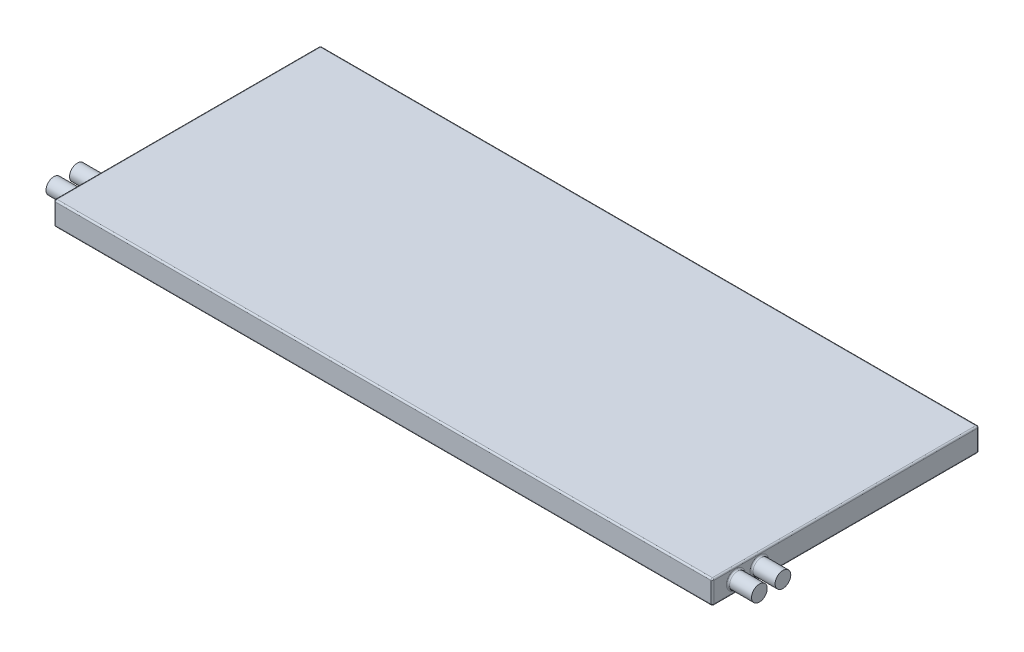
ISO-10303-21;
HEADER;
FILE_DESCRIPTION(('STEP AP214'),'2;1');
FILE_NAME('part.step','',(''),(''),'','','');
FILE_SCHEMA(('AUTOMOTIVE_DESIGN { 1 0 10303 214 1 1 1 1 }'));
ENDSEC;
DATA;
#1=APPLICATION_CONTEXT('core data for automotive mechanical design processes');
#2=APPLICATION_PROTOCOL_DEFINITION('international standard','automotive_design',2000,#1);
#3=PRODUCT_CONTEXT('',#1,'mechanical');
#4=PRODUCT('Part','Part','',(#3));
#5=PRODUCT_RELATED_PRODUCT_CATEGORY('part','',(#4));
#6=PRODUCT_DEFINITION_FORMATION('','',#4);
#7=PRODUCT_DEFINITION_CONTEXT('part definition',#1,'design');
#8=PRODUCT_DEFINITION('design','',#6,#7);
#9=PRODUCT_DEFINITION_SHAPE('','',#8);
#10=(LENGTH_UNIT() NAMED_UNIT(*) SI_UNIT(.MILLI.,.METRE.));
#11=(NAMED_UNIT(*) PLANE_ANGLE_UNIT() SI_UNIT($,.RADIAN.));
#12=(NAMED_UNIT(*) SI_UNIT($,.STERADIAN.) SOLID_ANGLE_UNIT());
#13=UNCERTAINTY_MEASURE_WITH_UNIT(LENGTH_MEASURE(1.E-05),#10,'distance_accuracy_value','');
#14=(GEOMETRIC_REPRESENTATION_CONTEXT(3) GLOBAL_UNCERTAINTY_ASSIGNED_CONTEXT((#13)) GLOBAL_UNIT_ASSIGNED_CONTEXT((#10,
#11,#12)) REPRESENTATION_CONTEXT('',''));
#15=CARTESIAN_POINT('',(0.,0.,0.));
#16=DIRECTION('',(0.,0.,1.));
#17=DIRECTION('',(1.,0.,0.));
#18=AXIS2_PLACEMENT_3D('',#15,#16,#17);
#19=CARTESIAN_POINT('',(-21.,1.5,8.50000000000001));
#20=DIRECTION('',(1.,0.,0.));
#21=DIRECTION('',(0.,0.,-1.));
#22=AXIS2_PLACEMENT_3D('',#19,#20,#21);
#23=PLANE('',#22);
#24=CARTESIAN_POINT('',(-21.,0.75,7.00000000000001));
#25=DIRECTION('',(1.,0.,0.));
#26=DIRECTION('',(0.,0.,-1.));
#27=AXIS2_PLACEMENT_3D('',#24,#25,#26);
#28=CIRCLE('',#27,0.600000000000001);
#29=CARTESIAN_POINT('',(-21.,0.75,6.40000000000001));
#30=VERTEX_POINT('',#29);
#31=EDGE_CURVE('E246',#30,#30,#28,.T.);
#32=ORIENTED_EDGE('',*,*,#31,.T.);
#33=EDGE_LOOP('',(#32));
#34=FACE_BOUND('',#33,.T.);
#35=CARTESIAN_POINT('',(-21.,0.749999999999999,5.50000000000001));
#36=DIRECTION('',(1.,0.,0.));
#37=DIRECTION('',(0.,0.,-1.));
#38=AXIS2_PLACEMENT_3D('',#35,#36,#37);
#39=CIRCLE('',#38,0.600000000000001);
#40=CARTESIAN_POINT('',(-21.,0.749999999999999,4.90000000000001));
#41=VERTEX_POINT('',#40);
#42=EDGE_CURVE('E243',#41,#41,#39,.T.);
#43=ORIENTED_EDGE('',*,*,#42,.T.);
#44=EDGE_LOOP('',(#43));
#45=FACE_BOUND('',#44,.T.);
#46=DIRECTION('',(0.,0.,1.));
#47=VECTOR('',#46,1.);
#48=CARTESIAN_POINT('',(-21.,1.4,-8.5));
#49=LINE('',#48,#47);
#50=CARTESIAN_POINT('',(-21.,1.4,8.40000000000001));
#51=VERTEX_POINT('',#50);
#52=CARTESIAN_POINT('',(-21.,1.4,-8.4));
#53=VERTEX_POINT('',#52);
#54=EDGE_CURVE('E236',#51,#53,#49,.F.);
#55=ORIENTED_EDGE('',*,*,#54,.T.);
#56=DIRECTION('',(0.,-1.,0.));
#57=VECTOR('',#56,1.);
#58=CARTESIAN_POINT('',(-21.,1.5,-8.4));
#59=LINE('',#58,#57);
#60=CARTESIAN_POINT('',(-21.,0.1,-8.4));
#61=VERTEX_POINT('',#60);
#62=EDGE_CURVE('E161',#53,#61,#59,.T.);
#63=ORIENTED_EDGE('',*,*,#62,.T.);
#64=DIRECTION('',(0.,0.,1.));
#65=VECTOR('',#64,1.);
#66=CARTESIAN_POINT('',(-21.,0.1,8.50000000000001));
#67=LINE('',#66,#65);
#68=CARTESIAN_POINT('',(-21.,0.1,8.40000000000001));
#69=VERTEX_POINT('',#68);
#70=EDGE_CURVE('E240',#61,#69,#67,.T.);
#71=ORIENTED_EDGE('',*,*,#70,.T.);
#72=DIRECTION('',(0.,-1.,0.));
#73=VECTOR('',#72,1.);
#74=CARTESIAN_POINT('',(-21.,1.5,8.40000000000001));
#75=LINE('',#74,#73);
#76=EDGE_CURVE('E238',#69,#51,#75,.F.);
#77=ORIENTED_EDGE('',*,*,#76,.T.);
#78=EDGE_LOOP('',(#55,#63,#71,#77));
#79=FACE_BOUND('',#78,.T.);
#80=ADVANCED_FACE('F39',(#34,#45,#79),#23,.F.);
#81=CARTESIAN_POINT('',(21.,1.5,8.5));
#82=DIRECTION('',(0.,0.,-1.));
#83=DIRECTION('',(-1.,0.,0.));
#84=AXIS2_PLACEMENT_3D('',#81,#82,#83);
#85=PLANE('',#84);
#86=DIRECTION('',(0.,-1.,0.));
#87=VECTOR('',#86,1.);
#88=CARTESIAN_POINT('',(-20.9,1.5,8.50000000000001));
#89=LINE('',#88,#87);
#90=CARTESIAN_POINT('',(-20.9,1.4,8.50000000000001));
#91=VERTEX_POINT('',#90);
#92=CARTESIAN_POINT('',(-20.9,0.1,8.50000000000001));
#93=VERTEX_POINT('',#92);
#94=EDGE_CURVE('E280',#91,#93,#89,.T.);
#95=ORIENTED_EDGE('',*,*,#94,.T.);
#96=DIRECTION('',(1.,0.,0.));
#97=VECTOR('',#96,1.);
#98=CARTESIAN_POINT('',(21.,0.1,8.5));
#99=LINE('',#98,#97);
#100=CARTESIAN_POINT('',(20.9,0.1,8.5));
#101=VERTEX_POINT('',#100);
#102=EDGE_CURVE('E283',#93,#101,#99,.T.);
#103=ORIENTED_EDGE('',*,*,#102,.T.);
#104=DIRECTION('',(0.,-1.,0.));
#105=VECTOR('',#104,1.);
#106=CARTESIAN_POINT('',(20.9,1.5,8.5));
#107=LINE('',#106,#105);
#108=CARTESIAN_POINT('',(20.9,1.4,8.5));
#109=VERTEX_POINT('',#108);
#110=EDGE_CURVE('E278',#101,#109,#107,.F.);
#111=ORIENTED_EDGE('',*,*,#110,.T.);
#112=DIRECTION('',(1.,0.,0.));
#113=VECTOR('',#112,1.);
#114=CARTESIAN_POINT('',(-21.,1.4,8.50000000000001));
#115=LINE('',#114,#113);
#116=EDGE_CURVE('E276',#109,#91,#115,.F.);
#117=ORIENTED_EDGE('',*,*,#116,.T.);
#118=EDGE_LOOP('',(#95,#103,#111,#117));
#119=FACE_BOUND('',#118,.T.);
#120=ADVANCED_FACE('F374',(#119),#85,.F.);
#121=CARTESIAN_POINT('',(21.,1.5,8.5));
#122=DIRECTION('',(-1.,0.,0.));
#123=DIRECTION('',(0.,0.,1.));
#124=AXIS2_PLACEMENT_3D('',#121,#122,#123);
#125=PLANE('',#124);
#126=CARTESIAN_POINT('',(21.,0.75,7.00000000000001));
#127=DIRECTION('',(-1.,0.,0.));
#128=DIRECTION('',(0.,0.,1.));
#129=AXIS2_PLACEMENT_3D('',#126,#127,#128);
#130=CIRCLE('',#129,0.600000000000001);
#131=CARTESIAN_POINT('',(21.,0.75,7.60000000000001));
#132=VERTEX_POINT('',#131);
#133=EDGE_CURVE('E267',#132,#132,#130,.T.);
#134=ORIENTED_EDGE('',*,*,#133,.T.);
#135=EDGE_LOOP('',(#134));
#136=FACE_BOUND('',#135,.T.);
#137=CARTESIAN_POINT('',(21.,0.749999999999999,5.50000000000001));
#138=DIRECTION('',(-1.,0.,0.));
#139=DIRECTION('',(0.,0.,1.));
#140=AXIS2_PLACEMENT_3D('',#137,#138,#139);
#141=CIRCLE('',#140,0.600000000000001);
#142=CARTESIAN_POINT('',(21.,0.749999999999999,6.10000000000001));
#143=VERTEX_POINT('',#142);
#144=EDGE_CURVE('E264',#143,#143,#141,.T.);
#145=ORIENTED_EDGE('',*,*,#144,.T.);
#146=EDGE_LOOP('',(#145));
#147=FACE_BOUND('',#146,.T.);
#148=DIRECTION('',(0.,0.,-1.));
#149=VECTOR('',#148,1.);
#150=CARTESIAN_POINT('',(21.,0.1,8.5));
#151=LINE('',#150,#149);
#152=CARTESIAN_POINT('',(21.,0.1,8.4));
#153=VERTEX_POINT('',#152);
#154=CARTESIAN_POINT('',(21.,0.1,-8.4));
#155=VERTEX_POINT('',#154);
#156=EDGE_CURVE('E259',#153,#155,#151,.T.);
#157=ORIENTED_EDGE('',*,*,#156,.T.);
#158=DIRECTION('',(0.,-1.,0.));
#159=VECTOR('',#158,1.);
#160=CARTESIAN_POINT('',(21.,1.5,-8.4));
#161=LINE('',#160,#159);
#162=CARTESIAN_POINT('',(21.,1.4,-8.4));
#163=VERTEX_POINT('',#162);
#164=EDGE_CURVE('E261',#155,#163,#161,.F.);
#165=ORIENTED_EDGE('',*,*,#164,.T.);
#166=DIRECTION('',(0.,0.,-1.));
#167=VECTOR('',#166,1.);
#168=CARTESIAN_POINT('',(21.,1.4,8.5));
#169=LINE('',#168,#167);
#170=CARTESIAN_POINT('',(21.,1.4,8.4));
#171=VERTEX_POINT('',#170);
#172=EDGE_CURVE('E255',#163,#171,#169,.F.);
#173=ORIENTED_EDGE('',*,*,#172,.T.);
#174=DIRECTION('',(0.,-1.,0.));
#175=VECTOR('',#174,1.);
#176=CARTESIAN_POINT('',(21.,1.5,8.4));
#177=LINE('',#176,#175);
#178=EDGE_CURVE('E257',#171,#153,#177,.T.);
#179=ORIENTED_EDGE('',*,*,#178,.T.);
#180=EDGE_LOOP('',(#157,#165,#173,#179));
#181=FACE_BOUND('',#180,.T.);
#182=ADVANCED_FACE('F343',(#136,#147,#181),#125,.F.);
#183=CARTESIAN_POINT('',(21.,1.5,-8.5));
#184=DIRECTION('',(0.,0.,1.));
#185=DIRECTION('',(1.,0.,0.));
#186=AXIS2_PLACEMENT_3D('',#183,#184,#185);
#187=PLANE('',#186);
#188=DIRECTION('',(0.,-1.,0.));
#189=VECTOR('',#188,1.);
#190=CARTESIAN_POINT('',(20.9,1.5,-8.5));
#191=LINE('',#190,#189);
#192=CARTESIAN_POINT('',(20.9,1.4,-8.5));
#193=VERTEX_POINT('',#192);
#194=CARTESIAN_POINT('',(20.9,0.1,-8.5));
#195=VERTEX_POINT('',#194);
#196=EDGE_CURVE('E138',#193,#195,#191,.T.);
#197=ORIENTED_EDGE('',*,*,#196,.T.);
#198=DIRECTION('',(-1.,0.,0.));
#199=VECTOR('',#198,1.);
#200=CARTESIAN_POINT('',(21.,0.1,-8.5));
#201=LINE('',#200,#199);
#202=CARTESIAN_POINT('',(-20.9,0.1,-8.5));
#203=VERTEX_POINT('',#202);
#204=EDGE_CURVE('E134',#195,#203,#201,.T.);
#205=ORIENTED_EDGE('',*,*,#204,.T.);
#206=DIRECTION('',(0.,-1.,0.));
#207=VECTOR('',#206,1.);
#208=CARTESIAN_POINT('',(-20.9,1.5,-8.5));
#209=LINE('',#208,#207);
#210=CARTESIAN_POINT('',(-20.9,1.4,-8.5));
#211=VERTEX_POINT('',#210);
#212=EDGE_CURVE('E128',#203,#211,#209,.F.);
#213=ORIENTED_EDGE('',*,*,#212,.T.);
#214=DIRECTION('',(-1.,0.,0.));
#215=VECTOR('',#214,1.);
#216=CARTESIAN_POINT('',(21.,1.4,-8.5));
#217=LINE('',#216,#215);
#218=EDGE_CURVE('E131',#211,#193,#217,.F.);
#219=ORIENTED_EDGE('',*,*,#218,.T.);
#220=EDGE_LOOP('',(#197,#205,#213,#219));
#221=FACE_BOUND('',#220,.T.);
#222=ADVANCED_FACE('F130',(#221),#187,.F.);
#223=CARTESIAN_POINT('',(0.,1.5,0.));
#224=DIRECTION('',(0.,1.,0.));
#225=DIRECTION('',(0.,0.,1.));
#226=AXIS2_PLACEMENT_3D('',#223,#224,#225);
#227=PLANE('',#226);
#228=DIRECTION('',(0.,0.,-1.));
#229=VECTOR('',#228,1.);
#230=CARTESIAN_POINT('',(20.9,1.5,-8.5));
#231=LINE('',#230,#229);
#232=CARTESIAN_POINT('',(20.9,1.5,8.4));
#233=VERTEX_POINT('',#232);
#234=CARTESIAN_POINT('',(20.9,1.5,-8.4));
#235=VERTEX_POINT('',#234);
#236=EDGE_CURVE('E48',#233,#235,#231,.T.);
#237=ORIENTED_EDGE('',*,*,#236,.T.);
#238=DIRECTION('',(-1.,0.,0.));
#239=VECTOR('',#238,1.);
#240=CARTESIAN_POINT('',(-21.,1.5,-8.4));
#241=LINE('',#240,#239);
#242=CARTESIAN_POINT('',(-20.9,1.5,-8.4));
#243=VERTEX_POINT('',#242);
#244=EDGE_CURVE('E11',#235,#243,#241,.T.);
#245=ORIENTED_EDGE('',*,*,#244,.T.);
#246=DIRECTION('',(0.,0.,1.));
#247=VECTOR('',#246,1.);
#248=CARTESIAN_POINT('',(-20.9,1.5,8.50000000000001));
#249=LINE('',#248,#247);
#250=CARTESIAN_POINT('',(-20.9,1.5,8.40000000000001));
#251=VERTEX_POINT('',#250);
#252=EDGE_CURVE('E285',#243,#251,#249,.T.);
#253=ORIENTED_EDGE('',*,*,#252,.T.);
#254=DIRECTION('',(1.,0.,0.));
#255=VECTOR('',#254,1.);
#256=CARTESIAN_POINT('',(21.,1.5,8.4));
#257=LINE('',#256,#255);
#258=EDGE_CURVE('E59',#251,#233,#257,.T.);
#259=ORIENTED_EDGE('',*,*,#258,.T.);
#260=EDGE_LOOP('',(#237,#245,#253,#259));
#261=FACE_BOUND('',#260,.T.);
#262=ADVANCED_FACE('F331',(#261),#227,.T.);
#263=CARTESIAN_POINT('',(0.,0.,0.));
#264=DIRECTION('',(0.,1.,0.));
#265=DIRECTION('',(0.,0.,1.));
#266=AXIS2_PLACEMENT_3D('',#263,#264,#265);
#267=PLANE('',#266);
#268=DIRECTION('',(0.,0.,1.));
#269=VECTOR('',#268,1.);
#270=CARTESIAN_POINT('',(-20.9,0.,0.));
#271=LINE('',#270,#269);
#272=CARTESIAN_POINT('',(-20.9,0.,8.40000000000001));
#273=VERTEX_POINT('',#272);
#274=CARTESIAN_POINT('',(-20.9,0.,-8.4));
#275=VERTEX_POINT('',#274);
#276=EDGE_CURVE('E231',#273,#275,#271,.F.);
#277=ORIENTED_EDGE('',*,*,#276,.T.);
#278=DIRECTION('',(-1.,0.,0.));
#279=VECTOR('',#278,1.);
#280=CARTESIAN_POINT('',(0.,0.,-8.4));
#281=LINE('',#280,#279);
#282=CARTESIAN_POINT('',(20.9,0.,-8.4));
#283=VERTEX_POINT('',#282);
#284=EDGE_CURVE('E233',#275,#283,#281,.F.);
#285=ORIENTED_EDGE('',*,*,#284,.T.);
#286=DIRECTION('',(0.,0.,-1.));
#287=VECTOR('',#286,1.);
#288=CARTESIAN_POINT('',(20.9,0.,0.));
#289=LINE('',#288,#287);
#290=CARTESIAN_POINT('',(20.9,0.,8.4));
#291=VERTEX_POINT('',#290);
#292=EDGE_CURVE('E229',#283,#291,#289,.F.);
#293=ORIENTED_EDGE('',*,*,#292,.T.);
#294=DIRECTION('',(1.,0.,0.));
#295=VECTOR('',#294,1.);
#296=CARTESIAN_POINT('',(0.,0.,8.4));
#297=LINE('',#296,#295);
#298=EDGE_CURVE('E227',#291,#273,#297,.F.);
#299=ORIENTED_EDGE('',*,*,#298,.T.);
#300=EDGE_LOOP('',(#277,#285,#293,#299));
#301=FACE_BOUND('',#300,.T.);
#302=ADVANCED_FACE('F314',(#301),#267,.F.);
#303=CARTESIAN_POINT('',(-22.5,0.75,7.00000000000001));
#304=DIRECTION('',(1.,0.,0.));
#305=DIRECTION('',(0.,0.,-1.));
#306=AXIS2_PLACEMENT_3D('',#303,#304,#305);
#307=CYLINDRICAL_SURFACE('',#306,0.500000000000001);
#308=CARTESIAN_POINT('',(-21.1,0.75,7.00000000000001));
#309=DIRECTION('',(1.,0.,0.));
#310=DIRECTION('',(0.,0.,-1.));
#311=AXIS2_PLACEMENT_3D('',#308,#309,#310);
#312=CIRCLE('',#311,0.500000000000001);
#313=CARTESIAN_POINT('',(-21.1,0.75,6.50000000000001));
#314=VERTEX_POINT('',#313);
#315=EDGE_CURVE('E249',#314,#314,#312,.F.);
#316=ORIENTED_EDGE('',*,*,#315,.T.);
#317=EDGE_LOOP('',(#316));
#318=FACE_BOUND('',#317,.T.);
#319=CARTESIAN_POINT('',(-22.5,0.75,7.00000000000001));
#320=DIRECTION('',(-1.,0.,0.));
#321=DIRECTION('',(0.,0.,1.));
#322=AXIS2_PLACEMENT_3D('',#319,#320,#321);
#323=CIRCLE('',#322,0.500000000000001);
#324=CARTESIAN_POINT('',(-22.5,0.75,7.50000000000001));
#325=VERTEX_POINT('',#324);
#326=EDGE_CURVE('E218',#325,#325,#323,.T.);
#327=ORIENTED_EDGE('',*,*,#326,.F.);
#328=EDGE_LOOP('',(#327));
#329=FACE_BOUND('',#328,.T.);
#330=ADVANCED_FACE('F632',(#318,#329),#307,.T.);
#331=CARTESIAN_POINT('',(-22.5,0.75,7.00000000000001));
#332=DIRECTION('',(-1.,0.,0.));
#333=DIRECTION('',(0.,0.,1.));
#334=AXIS2_PLACEMENT_3D('',#331,#332,#333);
#335=PLANE('',#334);
#336=ORIENTED_EDGE('',*,*,#326,.T.);
#337=EDGE_LOOP('',(#336));
#338=FACE_BOUND('',#337,.T.);
#339=ADVANCED_FACE('F623',(#338),#335,.T.);
#340=CARTESIAN_POINT('',(-22.5,0.749999999999999,5.50000000000001));
#341=DIRECTION('',(1.,0.,0.));
#342=DIRECTION('',(0.,0.,-1.));
#343=AXIS2_PLACEMENT_3D('',#340,#341,#342);
#344=CYLINDRICAL_SURFACE('',#343,0.500000000000001);
#345=CARTESIAN_POINT('',(-21.1,0.749999999999999,5.50000000000001));
#346=DIRECTION('',(1.,0.,0.));
#347=DIRECTION('',(0.,0.,-1.));
#348=AXIS2_PLACEMENT_3D('',#345,#346,#347);
#349=CIRCLE('',#348,0.500000000000001);
#350=CARTESIAN_POINT('',(-21.1,0.749999999999999,5.00000000000001));
#351=VERTEX_POINT('',#350);
#352=EDGE_CURVE('E252',#351,#351,#349,.F.);
#353=ORIENTED_EDGE('',*,*,#352,.T.);
#354=EDGE_LOOP('',(#353));
#355=FACE_BOUND('',#354,.T.);
#356=CARTESIAN_POINT('',(-22.5,0.749999999999999,5.50000000000001));
#357=DIRECTION('',(-1.,0.,0.));
#358=DIRECTION('',(0.,0.,1.));
#359=AXIS2_PLACEMENT_3D('',#356,#357,#358);
#360=CIRCLE('',#359,0.500000000000001);
#361=CARTESIAN_POINT('',(-22.5,0.749999999999999,6.00000000000001));
#362=VERTEX_POINT('',#361);
#363=EDGE_CURVE('E149',#362,#362,#360,.T.);
#364=ORIENTED_EDGE('',*,*,#363,.F.);
#365=EDGE_LOOP('',(#364));
#366=FACE_BOUND('',#365,.T.);
#367=ADVANCED_FACE('F614',(#355,#366),#344,.T.);
#368=CARTESIAN_POINT('',(-22.5,0.749999999999999,5.50000000000001));
#369=DIRECTION('',(-1.,0.,0.));
#370=DIRECTION('',(0.,0.,1.));
#371=AXIS2_PLACEMENT_3D('',#368,#369,#370);
#372=PLANE('',#371);
#373=ORIENTED_EDGE('',*,*,#363,.T.);
#374=EDGE_LOOP('',(#373));
#375=FACE_BOUND('',#374,.T.);
#376=ADVANCED_FACE('F605',(#375),#372,.T.);
#377=CARTESIAN_POINT('',(22.5,0.75,7.00000000000001));
#378=DIRECTION('',(-1.,0.,0.));
#379=DIRECTION('',(0.,0.,1.));
#380=AXIS2_PLACEMENT_3D('',#377,#378,#379);
#381=CYLINDRICAL_SURFACE('',#380,0.500000000000001);
#382=CARTESIAN_POINT('',(21.1,0.75,7.00000000000001));
#383=DIRECTION('',(-1.,0.,0.));
#384=DIRECTION('',(0.,0.,1.));
#385=AXIS2_PLACEMENT_3D('',#382,#383,#384);
#386=CIRCLE('',#385,0.500000000000001);
#387=CARTESIAN_POINT('',(21.1,0.75,7.50000000000001));
#388=VERTEX_POINT('',#387);
#389=EDGE_CURVE('E270',#388,#388,#386,.F.);
#390=ORIENTED_EDGE('',*,*,#389,.T.);
#391=EDGE_LOOP('',(#390));
#392=FACE_BOUND('',#391,.T.);
#393=CARTESIAN_POINT('',(22.5,0.75,7.00000000000001));
#394=DIRECTION('',(-1.,0.,0.));
#395=DIRECTION('',(0.,0.,1.));
#396=AXIS2_PLACEMENT_3D('',#393,#394,#395);
#397=CIRCLE('',#396,0.500000000000001);
#398=CARTESIAN_POINT('',(22.5,0.75,7.50000000000001));
#399=VERTEX_POINT('',#398);
#400=EDGE_CURVE('E208',#399,#399,#397,.T.);
#401=ORIENTED_EDGE('',*,*,#400,.T.);
#402=EDGE_LOOP('',(#401));
#403=FACE_BOUND('',#402,.T.);
#404=ADVANCED_FACE('F596',(#392,#403),#381,.T.);
#405=CARTESIAN_POINT('',(22.5,0.75,7.00000000000001));
#406=DIRECTION('',(1.,0.,0.));
#407=DIRECTION('',(0.,0.,1.));
#408=AXIS2_PLACEMENT_3D('',#405,#406,#407);
#409=PLANE('',#408);
#410=ORIENTED_EDGE('',*,*,#400,.F.);
#411=EDGE_LOOP('',(#410));
#412=FACE_BOUND('',#411,.T.);
#413=ADVANCED_FACE('F587',(#412),#409,.T.);
#414=CARTESIAN_POINT('',(22.5,0.749999999999999,5.50000000000001));
#415=DIRECTION('',(-1.,0.,0.));
#416=DIRECTION('',(0.,0.,1.));
#417=AXIS2_PLACEMENT_3D('',#414,#415,#416);
#418=CYLINDRICAL_SURFACE('',#417,0.500000000000001);
#419=CARTESIAN_POINT('',(21.1,0.749999999999999,5.50000000000001));
#420=DIRECTION('',(-1.,0.,0.));
#421=DIRECTION('',(0.,0.,1.));
#422=AXIS2_PLACEMENT_3D('',#419,#420,#421);
#423=CIRCLE('',#422,0.500000000000001);
#424=CARTESIAN_POINT('',(21.1,0.749999999999999,6.00000000000001));
#425=VERTEX_POINT('',#424);
#426=EDGE_CURVE('E273',#425,#425,#423,.F.);
#427=ORIENTED_EDGE('',*,*,#426,.T.);
#428=EDGE_LOOP('',(#427));
#429=FACE_BOUND('',#428,.T.);
#430=CARTESIAN_POINT('',(22.5,0.749999999999999,5.50000000000001));
#431=DIRECTION('',(-1.,0.,0.));
#432=DIRECTION('',(0.,0.,1.));
#433=AXIS2_PLACEMENT_3D('',#430,#431,#432);
#434=CIRCLE('',#433,0.500000000000001);
#435=CARTESIAN_POINT('',(22.5,0.749999999999999,6.00000000000001));
#436=VERTEX_POINT('',#435);
#437=EDGE_CURVE('E213',#436,#436,#434,.T.);
#438=ORIENTED_EDGE('',*,*,#437,.T.);
#439=EDGE_LOOP('',(#438));
#440=FACE_BOUND('',#439,.T.);
#441=ADVANCED_FACE('F578',(#429,#440),#418,.T.);
#442=CARTESIAN_POINT('',(22.5,0.749999999999999,5.50000000000001));
#443=DIRECTION('',(1.,0.,0.));
#444=DIRECTION('',(0.,0.,1.));
#445=AXIS2_PLACEMENT_3D('',#442,#443,#444);
#446=PLANE('',#445);
#447=ORIENTED_EDGE('',*,*,#437,.F.);
#448=EDGE_LOOP('',(#447));
#449=FACE_BOUND('',#448,.T.);
#450=ADVANCED_FACE('F570',(#449),#446,.T.);
#451=CARTESIAN_POINT('',(0.,1.4,8.4));
#452=DIRECTION('',(-1.,0.,0.));
#453=DIRECTION('',(0.,0.,1.));
#454=AXIS2_PLACEMENT_3D('',#451,#452,#453);
#455=CYLINDRICAL_SURFACE('',#454,0.1);
#456=CARTESIAN_POINT('',(20.9,1.4,8.4));
#457=DIRECTION('',(1.,0.,0.));
#458=DIRECTION('',(0.,0.,-1.));
#459=AXIS2_PLACEMENT_3D('',#456,#457,#458);
#460=CIRCLE('',#459,0.1);
#461=EDGE_CURVE('E43',#233,#109,#460,.T.);
#462=ORIENTED_EDGE('',*,*,#461,.F.);
#463=ORIENTED_EDGE('',*,*,#258,.F.);
#464=CARTESIAN_POINT('',(-20.9,1.4,8.40000000000001));
#465=DIRECTION('',(-1.,0.,0.));
#466=DIRECTION('',(0.,-1.,0.));
#467=AXIS2_PLACEMENT_3D('',#464,#465,#466);
#468=CIRCLE('',#467,0.1);
#469=EDGE_CURVE('E201',#91,#251,#468,.T.);
#470=ORIENTED_EDGE('',*,*,#469,.F.);
#471=ORIENTED_EDGE('',*,*,#116,.F.);
#472=EDGE_LOOP('',(#462,#463,#470,#471));
#473=FACE_BOUND('',#472,.T.);
#474=ADVANCED_FACE('F371',(#473),#455,.T.);
#475=CARTESIAN_POINT('',(20.9,1.4,8.4));
#476=DIRECTION('',(0.,0.,1.));
#477=DIRECTION('',(1.,0.,0.));
#478=AXIS2_PLACEMENT_3D('',#475,#476,#477);
#479=SPHERICAL_SURFACE('',#478,0.1);
#480=CARTESIAN_POINT('',(20.9,1.4,8.4));
#481=DIRECTION('',(0.,0.,1.));
#482=DIRECTION('',(1.,0.,0.));
#483=AXIS2_PLACEMENT_3D('',#480,#481,#482);
#484=CIRCLE('',#483,0.1);
#485=EDGE_CURVE('E196',#233,#171,#484,.F.);
#486=ORIENTED_EDGE('',*,*,#485,.F.);
#487=ORIENTED_EDGE('',*,*,#461,.T.);
#488=CARTESIAN_POINT('',(20.9,1.4,8.4));
#489=DIRECTION('',(0.,1.,0.));
#490=DIRECTION('',(0.,0.,1.));
#491=AXIS2_PLACEMENT_3D('',#488,#489,#490);
#492=CIRCLE('',#491,0.1);
#493=EDGE_CURVE('E199',#171,#109,#492,.F.);
#494=ORIENTED_EDGE('',*,*,#493,.F.);
#495=EDGE_LOOP('',(#486,#487,#494));
#496=FACE_BOUND('',#495,.T.);
#497=ADVANCED_FACE('F364',(#496),#479,.T.);
#498=CARTESIAN_POINT('',(-20.9,1.4,8.40000000000001));
#499=DIRECTION('',(0.,1.,0.));
#500=DIRECTION('',(0.,0.,1.));
#501=AXIS2_PLACEMENT_3D('',#498,#499,#500);
#502=SPHERICAL_SURFACE('',#501,0.1);
#503=CARTESIAN_POINT('',(-20.9,1.4,8.40000000000001));
#504=DIRECTION('',(0.,1.,0.));
#505=DIRECTION('',(0.,0.,1.));
#506=AXIS2_PLACEMENT_3D('',#503,#504,#505);
#507=CIRCLE('',#506,0.1);
#508=EDGE_CURVE('E190',#91,#51,#507,.F.);
#509=ORIENTED_EDGE('',*,*,#508,.F.);
#510=ORIENTED_EDGE('',*,*,#469,.T.);
#511=CARTESIAN_POINT('',(-20.9,1.4,8.40000000000001));
#512=DIRECTION('',(0.,0.,1.));
#513=DIRECTION('',(1.,0.,0.));
#514=AXIS2_PLACEMENT_3D('',#511,#512,#513);
#515=CIRCLE('',#514,0.1);
#516=EDGE_CURVE('E193',#51,#251,#515,.F.);
#517=ORIENTED_EDGE('',*,*,#516,.F.);
#518=EDGE_LOOP('',(#509,#510,#517));
#519=FACE_BOUND('',#518,.T.);
#520=ADVANCED_FACE('F362',(#519),#502,.T.);
#521=CARTESIAN_POINT('',(20.9,1.5,8.4));
#522=DIRECTION('',(0.,-1.,0.));
#523=DIRECTION('',(0.,0.,-1.));
#524=AXIS2_PLACEMENT_3D('',#521,#522,#523);
#525=CYLINDRICAL_SURFACE('',#524,0.1);
#526=ORIENTED_EDGE('',*,*,#493,.T.);
#527=ORIENTED_EDGE('',*,*,#110,.F.);
#528=CARTESIAN_POINT('',(20.9,0.1,8.4));
#529=DIRECTION('',(0.,-1.,0.));
#530=DIRECTION('',(0.,0.,-1.));
#531=AXIS2_PLACEMENT_3D('',#528,#529,#530);
#532=CIRCLE('',#531,0.1);
#533=EDGE_CURVE('E184',#153,#101,#532,.T.);
#534=ORIENTED_EDGE('',*,*,#533,.F.);
#535=ORIENTED_EDGE('',*,*,#178,.F.);
#536=EDGE_LOOP('',(#526,#527,#534,#535));
#537=FACE_BOUND('',#536,.T.);
#538=ADVANCED_FACE('F348',(#537),#525,.T.);
#539=CARTESIAN_POINT('',(20.9,1.4,0.));
#540=DIRECTION('',(0.,0.,1.));
#541=DIRECTION('',(1.,0.,0.));
#542=AXIS2_PLACEMENT_3D('',#539,#540,#541);
#543=CYLINDRICAL_SURFACE('',#542,0.1);
#544=ORIENTED_EDGE('',*,*,#485,.T.);
#545=ORIENTED_EDGE('',*,*,#172,.F.);
#546=CARTESIAN_POINT('',(20.9,1.4,-8.4));
#547=DIRECTION('',(0.,0.,-1.));
#548=DIRECTION('',(-1.,0.,0.));
#549=AXIS2_PLACEMENT_3D('',#546,#547,#548);
#550=CIRCLE('',#549,0.1);
#551=EDGE_CURVE('E181',#235,#163,#550,.T.);
#552=ORIENTED_EDGE('',*,*,#551,.F.);
#553=ORIENTED_EDGE('',*,*,#236,.F.);
#554=EDGE_LOOP('',(#544,#545,#552,#553));
#555=FACE_BOUND('',#554,.T.);
#556=ADVANCED_FACE('F335',(#555),#543,.T.);
#557=CARTESIAN_POINT('',(0.,1.4,-8.4));
#558=DIRECTION('',(1.,0.,0.));
#559=DIRECTION('',(0.,0.,-1.));
#560=AXIS2_PLACEMENT_3D('',#557,#558,#559);
#561=CYLINDRICAL_SURFACE('',#560,0.1);
#562=CARTESIAN_POINT('',(-20.9,1.4,-8.4));
#563=DIRECTION('',(-1.,0.,0.));
#564=DIRECTION('',(0.,0.,1.));
#565=AXIS2_PLACEMENT_3D('',#562,#563,#564);
#566=CIRCLE('',#565,0.1);
#567=EDGE_CURVE('E144',#243,#211,#566,.T.);
#568=ORIENTED_EDGE('',*,*,#567,.F.);
#569=ORIENTED_EDGE('',*,*,#244,.F.);
#570=CARTESIAN_POINT('',(20.9,1.4,-8.4));
#571=DIRECTION('',(1.,0.,0.));
#572=DIRECTION('',(0.,0.,-1.));
#573=AXIS2_PLACEMENT_3D('',#570,#571,#572);
#574=CIRCLE('',#573,0.1);
#575=EDGE_CURVE('E147',#193,#235,#574,.T.);
#576=ORIENTED_EDGE('',*,*,#575,.F.);
#577=ORIENTED_EDGE('',*,*,#218,.F.);
#578=EDGE_LOOP('',(#568,#569,#576,#577));
#579=FACE_BOUND('',#578,.T.);
#580=ADVANCED_FACE('F143',(#579),#561,.T.);
#581=CARTESIAN_POINT('',(-20.9,1.4,0.));
#582=DIRECTION('',(0.,0.,-1.));
#583=DIRECTION('',(-1.,0.,0.));
#584=AXIS2_PLACEMENT_3D('',#581,#582,#583);
#585=CYLINDRICAL_SURFACE('',#584,0.1);
#586=ORIENTED_EDGE('',*,*,#516,.T.);
#587=ORIENTED_EDGE('',*,*,#252,.F.);
#588=CARTESIAN_POINT('',(-20.9,1.4,-8.4));
#589=DIRECTION('',(0.,0.,-1.));
#590=DIRECTION('',(-1.,0.,0.));
#591=AXIS2_PLACEMENT_3D('',#588,#589,#590);
#592=CIRCLE('',#591,0.1);
#593=EDGE_CURVE('E157',#53,#243,#592,.T.);
#594=ORIENTED_EDGE('',*,*,#593,.F.);
#595=ORIENTED_EDGE('',*,*,#54,.F.);
#596=EDGE_LOOP('',(#586,#587,#594,#595));
#597=FACE_BOUND('',#596,.T.);
#598=ADVANCED_FACE('F330',(#597),#585,.T.);
#599=CARTESIAN_POINT('',(-20.9,1.5,8.40000000000001));
#600=DIRECTION('',(0.,-1.,0.));
#601=DIRECTION('',(0.,0.,-1.));
#602=AXIS2_PLACEMENT_3D('',#599,#600,#601);
#603=CYLINDRICAL_SURFACE('',#602,0.1);
#604=ORIENTED_EDGE('',*,*,#508,.T.);
#605=ORIENTED_EDGE('',*,*,#76,.F.);
#606=CARTESIAN_POINT('',(-20.9,0.1,8.40000000000001));
#607=DIRECTION('',(0.,-1.,0.));
#608=DIRECTION('',(0.,0.,-1.));
#609=AXIS2_PLACEMENT_3D('',#606,#607,#608);
#610=CIRCLE('',#609,0.1);
#611=EDGE_CURVE('E176',#93,#69,#610,.T.);
#612=ORIENTED_EDGE('',*,*,#611,.F.);
#613=ORIENTED_EDGE('',*,*,#94,.F.);
#614=EDGE_LOOP('',(#604,#605,#612,#613));
#615=FACE_BOUND('',#614,.T.);
#616=ADVANCED_FACE('F361',(#615),#603,.T.);
#617=CARTESIAN_POINT('',(21.,0.1,8.4));
#618=DIRECTION('',(1.,0.,0.));
#619=DIRECTION('',(0.,0.,-1.));
#620=AXIS2_PLACEMENT_3D('',#617,#618,#619);
#621=CYLINDRICAL_SURFACE('',#620,0.1);
#622=CARTESIAN_POINT('',(20.9,0.1,8.4));
#623=DIRECTION('',(1.,0.,0.));
#624=DIRECTION('',(0.,0.,-1.));
#625=AXIS2_PLACEMENT_3D('',#622,#623,#624);
#626=CIRCLE('',#625,0.1);
#627=EDGE_CURVE('E187',#101,#291,#626,.T.);
#628=ORIENTED_EDGE('',*,*,#627,.F.);
#629=ORIENTED_EDGE('',*,*,#102,.F.);
#630=CARTESIAN_POINT('',(-20.9,0.1,8.40000000000001));
#631=DIRECTION('',(-1.,0.,0.));
#632=DIRECTION('',(0.,0.,1.));
#633=AXIS2_PLACEMENT_3D('',#630,#631,#632);
#634=CIRCLE('',#633,0.1);
#635=EDGE_CURVE('E174',#273,#93,#634,.T.);
#636=ORIENTED_EDGE('',*,*,#635,.F.);
#637=ORIENTED_EDGE('',*,*,#298,.F.);
#638=EDGE_LOOP('',(#628,#629,#636,#637));
#639=FACE_BOUND('',#638,.T.);
#640=ADVANCED_FACE('F354',(#639),#621,.T.);
#641=CARTESIAN_POINT('',(20.9,0.1,8.4));
#642=DIRECTION('',(0.,0.,1.));
#643=DIRECTION('',(0.,-1.,0.));
#644=AXIS2_PLACEMENT_3D('',#641,#642,#643);
#645=SPHERICAL_SURFACE('',#644,0.1);
#646=ORIENTED_EDGE('',*,*,#533,.T.);
#647=ORIENTED_EDGE('',*,*,#627,.T.);
#648=CARTESIAN_POINT('',(20.9,0.1,8.4));
#649=DIRECTION('',(0.,0.,1.));
#650=DIRECTION('',(1.,0.,0.));
#651=AXIS2_PLACEMENT_3D('',#648,#649,#650);
#652=CIRCLE('',#651,0.1);
#653=EDGE_CURVE('E165',#153,#291,#652,.F.);
#654=ORIENTED_EDGE('',*,*,#653,.F.);
#655=EDGE_LOOP('',(#646,#647,#654));
#656=FACE_BOUND('',#655,.T.);
#657=ADVANCED_FACE('F351',(#656),#645,.T.);
#658=CARTESIAN_POINT('',(20.9,1.4,-8.4));
#659=DIRECTION('',(0.,1.,0.));
#660=DIRECTION('',(0.,0.,1.));
#661=AXIS2_PLACEMENT_3D('',#658,#659,#660);
#662=SPHERICAL_SURFACE('',#661,0.1);
#663=ORIENTED_EDGE('',*,*,#575,.T.);
#664=ORIENTED_EDGE('',*,*,#551,.T.);
#665=CARTESIAN_POINT('',(20.9,1.4,-8.4));
#666=DIRECTION('',(0.,1.,0.));
#667=DIRECTION('',(0.,0.,1.));
#668=AXIS2_PLACEMENT_3D('',#665,#666,#667);
#669=CIRCLE('',#668,0.1);
#670=EDGE_CURVE('E162',#193,#163,#669,.F.);
#671=ORIENTED_EDGE('',*,*,#670,.F.);
#672=EDGE_LOOP('',(#663,#664,#671));
#673=FACE_BOUND('',#672,.T.);
#674=ADVANCED_FACE('F337',(#673),#662,.T.);
#675=CARTESIAN_POINT('',(-20.9,1.4,-8.4));
#676=DIRECTION('',(0.,1.,0.));
#677=DIRECTION('',(0.,0.,1.));
#678=AXIS2_PLACEMENT_3D('',#675,#676,#677);
#679=SPHERICAL_SURFACE('',#678,0.1);
#680=ORIENTED_EDGE('',*,*,#593,.T.);
#681=ORIENTED_EDGE('',*,*,#567,.T.);
#682=CARTESIAN_POINT('',(-20.9,1.4,-8.4));
#683=DIRECTION('',(0.,1.,0.));
#684=DIRECTION('',(0.,0.,1.));
#685=AXIS2_PLACEMENT_3D('',#682,#683,#684);
#686=CIRCLE('',#685,0.1);
#687=EDGE_CURVE('E154',#53,#211,#686,.F.);
#688=ORIENTED_EDGE('',*,*,#687,.F.);
#689=EDGE_LOOP('',(#680,#681,#688));
#690=FACE_BOUND('',#689,.T.);
#691=ADVANCED_FACE('F153',(#690),#679,.T.);
#692=CARTESIAN_POINT('',(-20.9,0.1,8.40000000000001));
#693=DIRECTION('',(0.,0.,1.));
#694=DIRECTION('',(1.,0.,0.));
#695=AXIS2_PLACEMENT_3D('',#692,#693,#694);
#696=SPHERICAL_SURFACE('',#695,0.1);
#697=ORIENTED_EDGE('',*,*,#635,.T.);
#698=ORIENTED_EDGE('',*,*,#611,.T.);
#699=CARTESIAN_POINT('',(-20.9,0.1,8.40000000000001));
#700=DIRECTION('',(0.,0.,1.));
#701=DIRECTION('',(1.,0.,0.));
#702=AXIS2_PLACEMENT_3D('',#699,#700,#701);
#703=CIRCLE('',#702,0.1);
#704=EDGE_CURVE('E163',#273,#69,#703,.F.);
#705=ORIENTED_EDGE('',*,*,#704,.F.);
#706=EDGE_LOOP('',(#697,#698,#705));
#707=FACE_BOUND('',#706,.T.);
#708=ADVANCED_FACE('F358',(#707),#696,.T.);
#709=CARTESIAN_POINT('',(20.9,0.1,8.5));
#710=DIRECTION('',(0.,0.,-1.));
#711=DIRECTION('',(-1.,0.,0.));
#712=AXIS2_PLACEMENT_3D('',#709,#710,#711);
#713=CYLINDRICAL_SURFACE('',#712,0.1);
#714=ORIENTED_EDGE('',*,*,#653,.T.);
#715=ORIENTED_EDGE('',*,*,#292,.F.);
#716=CARTESIAN_POINT('',(20.9,0.1,-8.4));
#717=DIRECTION('',(0.,0.,-1.));
#718=DIRECTION('',(-1.,0.,0.));
#719=AXIS2_PLACEMENT_3D('',#716,#717,#718);
#720=CIRCLE('',#719,0.1);
#721=EDGE_CURVE('E168',#155,#283,#720,.T.);
#722=ORIENTED_EDGE('',*,*,#721,.F.);
#723=ORIENTED_EDGE('',*,*,#156,.F.);
#724=EDGE_LOOP('',(#714,#715,#722,#723));
#725=FACE_BOUND('',#724,.T.);
#726=ADVANCED_FACE('F309',(#725),#713,.T.);
#727=CARTESIAN_POINT('',(20.9,1.5,-8.4));
#728=DIRECTION('',(0.,-1.,0.));
#729=DIRECTION('',(0.,0.,-1.));
#730=AXIS2_PLACEMENT_3D('',#727,#728,#729);
#731=CYLINDRICAL_SURFACE('',#730,0.1);
#732=ORIENTED_EDGE('',*,*,#670,.T.);
#733=ORIENTED_EDGE('',*,*,#164,.F.);
#734=CARTESIAN_POINT('',(20.9,0.1,-8.4));
#735=DIRECTION('',(0.,-1.,0.));
#736=DIRECTION('',(0.,0.,-1.));
#737=AXIS2_PLACEMENT_3D('',#734,#735,#736);
#738=CIRCLE('',#737,0.1);
#739=EDGE_CURVE('E298',#195,#155,#738,.T.);
#740=ORIENTED_EDGE('',*,*,#739,.F.);
#741=ORIENTED_EDGE('',*,*,#196,.F.);
#742=EDGE_LOOP('',(#732,#733,#740,#741));
#743=FACE_BOUND('',#742,.T.);
#744=ADVANCED_FACE('F341',(#743),#731,.T.);
#745=CARTESIAN_POINT('',(-20.9,1.5,-8.4));
#746=DIRECTION('',(0.,-1.,0.));
#747=DIRECTION('',(0.,0.,-1.));
#748=AXIS2_PLACEMENT_3D('',#745,#746,#747);
#749=CYLINDRICAL_SURFACE('',#748,0.1);
#750=ORIENTED_EDGE('',*,*,#687,.T.);
#751=ORIENTED_EDGE('',*,*,#212,.F.);
#752=CARTESIAN_POINT('',(-20.9,0.1,-8.4));
#753=DIRECTION('',(0.,-1.,0.));
#754=DIRECTION('',(0.,0.,-1.));
#755=AXIS2_PLACEMENT_3D('',#752,#753,#754);
#756=CIRCLE('',#755,0.1);
#757=EDGE_CURVE('E295',#61,#203,#756,.T.);
#758=ORIENTED_EDGE('',*,*,#757,.F.);
#759=ORIENTED_EDGE('',*,*,#62,.F.);
#760=EDGE_LOOP('',(#750,#751,#758,#759));
#761=FACE_BOUND('',#760,.T.);
#762=ADVANCED_FACE('F159',(#761),#749,.T.);
#763=CARTESIAN_POINT('',(-20.9,0.1,8.50000000000001));
#764=DIRECTION('',(0.,0.,1.));
#765=DIRECTION('',(1.,0.,0.));
#766=AXIS2_PLACEMENT_3D('',#763,#764,#765);
#767=CYLINDRICAL_SURFACE('',#766,0.1);
#768=ORIENTED_EDGE('',*,*,#704,.T.);
#769=ORIENTED_EDGE('',*,*,#70,.F.);
#770=CARTESIAN_POINT('',(-20.9,0.1,-8.4));
#771=DIRECTION('',(0.,0.,-1.));
#772=DIRECTION('',(-1.,0.,0.));
#773=AXIS2_PLACEMENT_3D('',#770,#771,#772);
#774=CIRCLE('',#773,0.1);
#775=EDGE_CURVE('E293',#275,#61,#774,.T.);
#776=ORIENTED_EDGE('',*,*,#775,.F.);
#777=ORIENTED_EDGE('',*,*,#276,.F.);
#778=EDGE_LOOP('',(#768,#769,#776,#777));
#779=FACE_BOUND('',#778,.T.);
#780=ADVANCED_FACE('F324',(#779),#767,.T.);
#781=CARTESIAN_POINT('',(20.9,0.1,-8.4));
#782=DIRECTION('',(1.,0.,0.));
#783=DIRECTION('',(0.,1.,0.));
#784=AXIS2_PLACEMENT_3D('',#781,#782,#783);
#785=SPHERICAL_SURFACE('',#784,0.1);
#786=ORIENTED_EDGE('',*,*,#739,.T.);
#787=ORIENTED_EDGE('',*,*,#721,.T.);
#788=CARTESIAN_POINT('',(20.9,0.1,-8.4));
#789=DIRECTION('',(1.,0.,0.));
#790=DIRECTION('',(0.,0.,-1.));
#791=AXIS2_PLACEMENT_3D('',#788,#789,#790);
#792=CIRCLE('',#791,0.1);
#793=EDGE_CURVE('E291',#195,#283,#792,.F.);
#794=ORIENTED_EDGE('',*,*,#793,.F.);
#795=EDGE_LOOP('',(#786,#787,#794));
#796=FACE_BOUND('',#795,.T.);
#797=ADVANCED_FACE('F305',(#796),#785,.T.);
#798=CARTESIAN_POINT('',(-20.9,0.1,-8.4));
#799=DIRECTION('',(-1.,0.,0.));
#800=DIRECTION('',(0.,-1.,0.));
#801=AXIS2_PLACEMENT_3D('',#798,#799,#800);
#802=SPHERICAL_SURFACE('',#801,0.1);
#803=ORIENTED_EDGE('',*,*,#775,.T.);
#804=ORIENTED_EDGE('',*,*,#757,.T.);
#805=CARTESIAN_POINT('',(-20.9,0.1,-8.4));
#806=DIRECTION('',(-1.,0.,0.));
#807=DIRECTION('',(0.,0.,1.));
#808=AXIS2_PLACEMENT_3D('',#805,#806,#807);
#809=CIRCLE('',#808,0.1);
#810=EDGE_CURVE('E289',#275,#203,#809,.F.);
#811=ORIENTED_EDGE('',*,*,#810,.F.);
#812=EDGE_LOOP('',(#803,#804,#811));
#813=FACE_BOUND('',#812,.T.);
#814=ADVANCED_FACE('F321',(#813),#802,.T.);
#815=CARTESIAN_POINT('',(21.,0.1,-8.4));
#816=DIRECTION('',(-1.,0.,0.));
#817=DIRECTION('',(0.,0.,1.));
#818=AXIS2_PLACEMENT_3D('',#815,#816,#817);
#819=CYLINDRICAL_SURFACE('',#818,0.1);
#820=ORIENTED_EDGE('',*,*,#793,.T.);
#821=ORIENTED_EDGE('',*,*,#284,.F.);
#822=ORIENTED_EDGE('',*,*,#810,.T.);
#823=ORIENTED_EDGE('',*,*,#204,.F.);
#824=EDGE_LOOP('',(#820,#821,#822,#823));
#825=FACE_BOUND('',#824,.T.);
#826=ADVANCED_FACE('F319',(#825),#819,.T.);
#827=CARTESIAN_POINT('',(-21.1,0.75,7.00000000000001));
#828=DIRECTION('',(1.,0.,0.));
#829=DIRECTION('',(0.,0.,-1.));
#830=AXIS2_PLACEMENT_3D('',#827,#828,#829);
#831=TOROIDAL_SURFACE('',#830,0.600000000000001,0.1);
#832=ORIENTED_EDGE('',*,*,#31,.F.);
#833=EDGE_LOOP('',(#832));
#834=FACE_BOUND('',#833,.T.);
#835=ORIENTED_EDGE('',*,*,#315,.F.);
#836=EDGE_LOOP('',(#835));
#837=FACE_BOUND('',#836,.T.);
#838=ADVANCED_FACE('F388',(#834,#837),#831,.F.);
#839=CARTESIAN_POINT('',(-21.1,0.749999999999999,5.50000000000001));
#840=DIRECTION('',(1.,0.,0.));
#841=DIRECTION('',(0.,0.,-1.));
#842=AXIS2_PLACEMENT_3D('',#839,#840,#841);
#843=TOROIDAL_SURFACE('',#842,0.600000000000001,0.1);
#844=ORIENTED_EDGE('',*,*,#42,.F.);
#845=EDGE_LOOP('',(#844));
#846=FACE_BOUND('',#845,.T.);
#847=ORIENTED_EDGE('',*,*,#352,.F.);
#848=EDGE_LOOP('',(#847));
#849=FACE_BOUND('',#848,.T.);
#850=ADVANCED_FACE('F504',(#846,#849),#843,.F.);
#851=CARTESIAN_POINT('',(21.1,0.75,7.00000000000001));
#852=DIRECTION('',(-1.,0.,0.));
#853=DIRECTION('',(0.,0.,1.));
#854=AXIS2_PLACEMENT_3D('',#851,#852,#853);
#855=TOROIDAL_SURFACE('',#854,0.600000000000001,0.1);
#856=ORIENTED_EDGE('',*,*,#389,.F.);
#857=EDGE_LOOP('',(#856));
#858=FACE_BOUND('',#857,.T.);
#859=ORIENTED_EDGE('',*,*,#133,.F.);
#860=EDGE_LOOP('',(#859));
#861=FACE_BOUND('',#860,.T.);
#862=ADVANCED_FACE('F513',(#858,#861),#855,.F.);
#863=CARTESIAN_POINT('',(21.1,0.749999999999999,5.50000000000001));
#864=DIRECTION('',(-1.,0.,0.));
#865=DIRECTION('',(0.,0.,1.));
#866=AXIS2_PLACEMENT_3D('',#863,#864,#865);
#867=TOROIDAL_SURFACE('',#866,0.600000000000001,0.1);
#868=ORIENTED_EDGE('',*,*,#426,.F.);
#869=EDGE_LOOP('',(#868));
#870=FACE_BOUND('',#869,.T.);
#871=ORIENTED_EDGE('',*,*,#144,.F.);
#872=EDGE_LOOP('',(#871));
#873=FACE_BOUND('',#872,.T.);
#874=ADVANCED_FACE('F41',(#870,#873),#867,.F.);
#875=CLOSED_SHELL('',(#80,#120,#182,#222,#262,#302,#330,#339,#367,#376,#404,#413,#441,#450,#474,
#497,#520,#538,#556,#580,#598,#616,#640,#657,#674,#691,#708,#726,#744,#762,#780,#797,#814,#826,
#838,#850,#862,#874));
#876=MANIFOLD_SOLID_BREP('B2',#875);
#877=ADVANCED_BREP_SHAPE_REPRESENTATION('',(#18,#876),#14);
#878=SHAPE_DEFINITION_REPRESENTATION(#9,#877);
ENDSEC;
END-ISO-10303-21;
